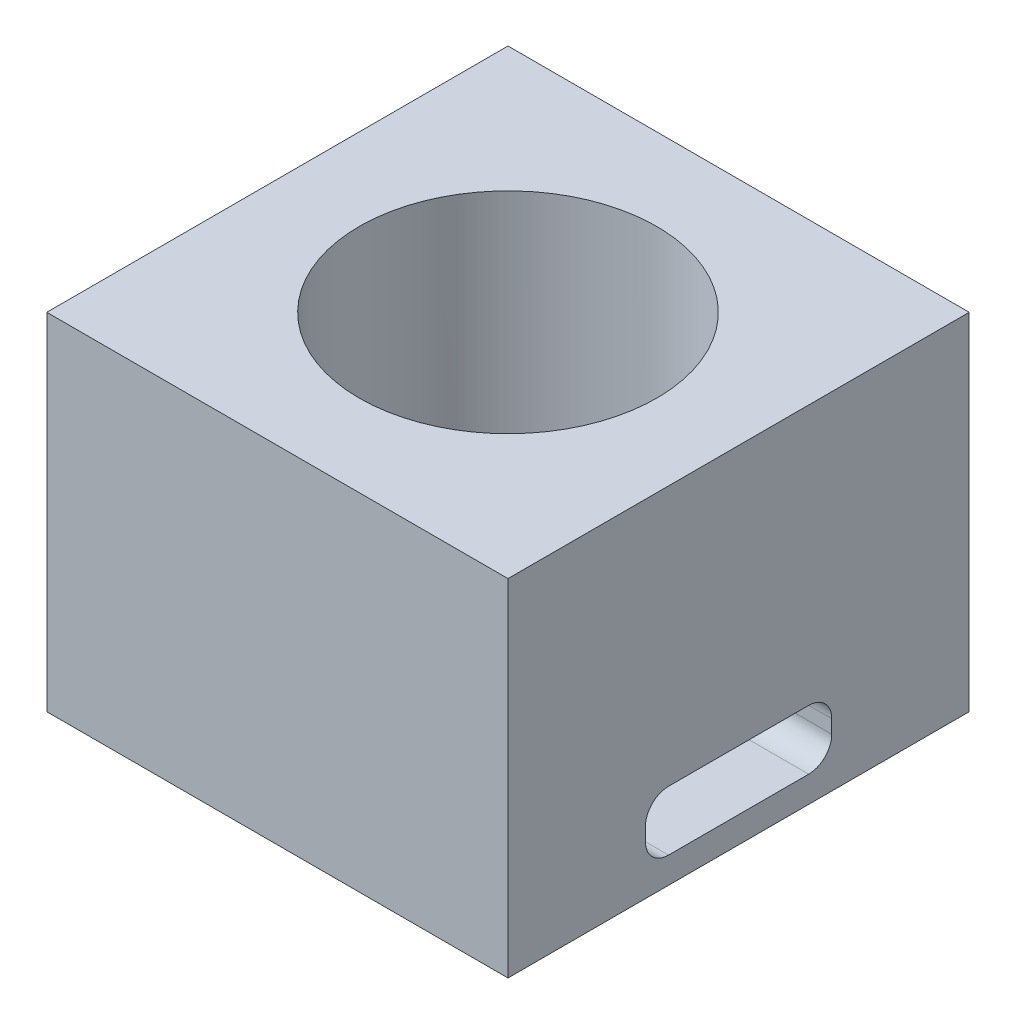
ISO-10303-21;
HEADER;
FILE_DESCRIPTION(('STEP AP214'),'2;1');
FILE_NAME('part.step','',(''),(''),'','','');
FILE_SCHEMA(('AUTOMOTIVE_DESIGN { 1 0 10303 214 1 1 1 1 }'));
ENDSEC;
DATA;
#1=APPLICATION_CONTEXT('core data for automotive mechanical design processes');
#2=APPLICATION_PROTOCOL_DEFINITION('international standard','automotive_design',2000,#1);
#3=PRODUCT_CONTEXT('',#1,'mechanical');
#4=PRODUCT('Part','Part','',(#3));
#5=PRODUCT_RELATED_PRODUCT_CATEGORY('part','',(#4));
#6=PRODUCT_DEFINITION_FORMATION('','',#4);
#7=PRODUCT_DEFINITION_CONTEXT('part definition',#1,'design');
#8=PRODUCT_DEFINITION('design','',#6,#7);
#9=PRODUCT_DEFINITION_SHAPE('','',#8);
#10=(LENGTH_UNIT() NAMED_UNIT(*) SI_UNIT(.MILLI.,.METRE.));
#11=(NAMED_UNIT(*) PLANE_ANGLE_UNIT() SI_UNIT($,.RADIAN.));
#12=(NAMED_UNIT(*) SI_UNIT($,.STERADIAN.) SOLID_ANGLE_UNIT());
#13=UNCERTAINTY_MEASURE_WITH_UNIT(LENGTH_MEASURE(1.E-05),#10,'distance_accuracy_value','');
#14=(GEOMETRIC_REPRESENTATION_CONTEXT(3) GLOBAL_UNCERTAINTY_ASSIGNED_CONTEXT((#13)) GLOBAL_UNIT_ASSIGNED_CONTEXT((#10,
#11,#12)) REPRESENTATION_CONTEXT('',''));
#15=CARTESIAN_POINT('',(0.,0.,0.));
#16=DIRECTION('',(0.,0.,1.));
#17=DIRECTION('',(1.,0.,0.));
#18=AXIS2_PLACEMENT_3D('',#15,#16,#17);
#19=CARTESIAN_POINT('',(25.4,38.1,25.4));
#20=DIRECTION('',(-1.,0.,0.));
#21=DIRECTION('',(0.,0.,1.));
#22=AXIS2_PLACEMENT_3D('',#19,#20,#21);
#23=PLANE('',#22);
#24=DIRECTION('',(0.,0.,1.));
#25=VECTOR('',#24,1.);
#26=CARTESIAN_POINT('',(25.4,9.44561507478677,7.71809552719259));
#27=LINE('',#26,#25);
#28=CARTESIAN_POINT('',(25.4,9.44561507478677,-7.71809552719259));
#29=VERTEX_POINT('',#28);
#30=CARTESIAN_POINT('',(25.4,9.44561507478677,7.71809552719259));
#31=VERTEX_POINT('',#30);
#32=EDGE_CURVE('E139',#29,#31,#27,.T.);
#33=ORIENTED_EDGE('',*,*,#32,.F.);
#34=CARTESIAN_POINT('',(25.4,6.90561507478677,-7.7180955271926));
#35=DIRECTION('',(1.,0.,0.));
#36=DIRECTION('',(0.,0.,1.));
#37=AXIS2_PLACEMENT_3D('',#34,#35,#36);
#38=CIRCLE('',#37,2.54);
#39=CARTESIAN_POINT('',(25.4,6.90561507478675,-10.2580955271926));
#40=VERTEX_POINT('',#39);
#41=EDGE_CURVE('E53',#40,#29,#38,.T.);
#42=ORIENTED_EDGE('',*,*,#41,.F.);
#43=DIRECTION('',(0.,1.,0.));
#44=VECTOR('',#43,1.);
#45=CARTESIAN_POINT('',(25.4,6.90561507478675,-10.2580955271926));
#46=LINE('',#45,#44);
#47=CARTESIAN_POINT('',(25.4,5.42459966145548,-10.2580955271926));
#48=VERTEX_POINT('',#47);
#49=EDGE_CURVE('E160',#48,#40,#46,.T.);
#50=ORIENTED_EDGE('',*,*,#49,.F.);
#51=CARTESIAN_POINT('',(25.4,5.42459966145546,-7.7180955271926));
#52=DIRECTION('',(1.,0.,0.));
#53=DIRECTION('',(0.,0.,1.));
#54=AXIS2_PLACEMENT_3D('',#51,#52,#53);
#55=CIRCLE('',#54,2.54);
#56=CARTESIAN_POINT('',(25.4,2.88459966145546,-7.71809552719259));
#57=VERTEX_POINT('',#56);
#58=EDGE_CURVE('E157',#57,#48,#55,.T.);
#59=ORIENTED_EDGE('',*,*,#58,.F.);
#60=DIRECTION('',(0.,0.,-1.));
#61=VECTOR('',#60,1.);
#62=CARTESIAN_POINT('',(25.4,2.88459966145546,7.71809552719259));
#63=LINE('',#62,#61);
#64=CARTESIAN_POINT('',(25.4,2.88459966145546,7.71809552719259));
#65=VERTEX_POINT('',#64);
#66=EDGE_CURVE('E154',#65,#57,#63,.T.);
#67=ORIENTED_EDGE('',*,*,#66,.F.);
#68=CARTESIAN_POINT('',(25.4,5.42459966145546,7.7180955271926));
#69=DIRECTION('',(1.,0.,0.));
#70=DIRECTION('',(0.,0.,1.));
#71=AXIS2_PLACEMENT_3D('',#68,#69,#70);
#72=CIRCLE('',#71,2.54);
#73=CARTESIAN_POINT('',(25.4,5.42459966145548,10.2580955271926));
#74=VERTEX_POINT('',#73);
#75=EDGE_CURVE('E148',#74,#65,#72,.T.);
#76=ORIENTED_EDGE('',*,*,#75,.F.);
#77=DIRECTION('',(0.,-1.,0.));
#78=VECTOR('',#77,1.);
#79=CARTESIAN_POINT('',(25.4,6.90561507478675,10.2580955271926));
#80=LINE('',#79,#78);
#81=CARTESIAN_POINT('',(25.4,6.90561507478675,10.2580955271926));
#82=VERTEX_POINT('',#81);
#83=EDGE_CURVE('E146',#82,#74,#80,.T.);
#84=ORIENTED_EDGE('',*,*,#83,.F.);
#85=CARTESIAN_POINT('',(25.4,6.90561507478677,7.7180955271926));
#86=DIRECTION('',(1.,0.,0.));
#87=DIRECTION('',(0.,0.,-1.));
#88=AXIS2_PLACEMENT_3D('',#85,#86,#87);
#89=CIRCLE('',#88,2.54);
#90=EDGE_CURVE('E130',#31,#82,#89,.T.);
#91=ORIENTED_EDGE('',*,*,#90,.F.);
#92=EDGE_LOOP('',(#33,#42,#50,#59,#67,#76,#84,#91));
#93=FACE_BOUND('',#92,.T.);
#94=DIRECTION('',(0.,0.,-1.));
#95=VECTOR('',#94,1.);
#96=CARTESIAN_POINT('',(25.4,0.,25.4));
#97=LINE('',#96,#95);
#98=CARTESIAN_POINT('',(25.4,0.,25.4));
#99=VERTEX_POINT('',#98);
#100=CARTESIAN_POINT('',(25.4,0.,-25.4));
#101=VERTEX_POINT('',#100);
#102=EDGE_CURVE('E190',#99,#101,#97,.T.);
#103=ORIENTED_EDGE('',*,*,#102,.T.);
#104=DIRECTION('',(0.,-1.,0.));
#105=VECTOR('',#104,1.);
#106=CARTESIAN_POINT('',(25.4,38.1,-25.4));
#107=LINE('',#106,#105);
#108=CARTESIAN_POINT('',(25.4,38.1,-25.4));
#109=VERTEX_POINT('',#108);
#110=EDGE_CURVE('E206',#109,#101,#107,.T.);
#111=ORIENTED_EDGE('',*,*,#110,.F.);
#112=DIRECTION('',(0.,0.,-1.));
#113=VECTOR('',#112,1.);
#114=CARTESIAN_POINT('',(25.4,38.1,25.4));
#115=LINE('',#114,#113);
#116=CARTESIAN_POINT('',(25.4,38.1,25.4));
#117=VERTEX_POINT('',#116);
#118=EDGE_CURVE('E179',#117,#109,#115,.T.);
#119=ORIENTED_EDGE('',*,*,#118,.F.);
#120=DIRECTION('',(0.,-1.,0.));
#121=VECTOR('',#120,1.);
#122=CARTESIAN_POINT('',(25.4,38.1,25.4));
#123=LINE('',#122,#121);
#124=EDGE_CURVE('E189',#117,#99,#123,.T.);
#125=ORIENTED_EDGE('',*,*,#124,.T.);
#126=EDGE_LOOP('',(#103,#111,#119,#125));
#127=FACE_BOUND('',#126,.T.);
#128=ADVANCED_FACE('F33',(#93,#127),#23,.F.);
#129=CARTESIAN_POINT('',(-25.4,38.1,-25.4));
#130=DIRECTION('',(0.,0.,1.));
#131=DIRECTION('',(1.,0.,0.));
#132=AXIS2_PLACEMENT_3D('',#129,#130,#131);
#133=PLANE('',#132);
#134=DIRECTION('',(-1.,0.,0.));
#135=VECTOR('',#134,1.);
#136=CARTESIAN_POINT('',(-25.4,0.,-25.4));
#137=LINE('',#136,#135);
#138=CARTESIAN_POINT('',(-25.4,0.,-25.4));
#139=VERTEX_POINT('',#138);
#140=EDGE_CURVE('E193',#101,#139,#137,.T.);
#141=ORIENTED_EDGE('',*,*,#140,.T.);
#142=DIRECTION('',(0.,-1.,0.));
#143=VECTOR('',#142,1.);
#144=CARTESIAN_POINT('',(-25.4,38.1,-25.4));
#145=LINE('',#144,#143);
#146=CARTESIAN_POINT('',(-25.4,38.1,-25.4));
#147=VERTEX_POINT('',#146);
#148=EDGE_CURVE('E203',#147,#139,#145,.T.);
#149=ORIENTED_EDGE('',*,*,#148,.F.);
#150=DIRECTION('',(-1.,0.,0.));
#151=VECTOR('',#150,1.);
#152=CARTESIAN_POINT('',(-25.4,38.1,-25.4));
#153=LINE('',#152,#151);
#154=EDGE_CURVE('E182',#109,#147,#153,.T.);
#155=ORIENTED_EDGE('',*,*,#154,.F.);
#156=ORIENTED_EDGE('',*,*,#110,.T.);
#157=EDGE_LOOP('',(#141,#149,#155,#156));
#158=FACE_BOUND('',#157,.T.);
#159=ADVANCED_FACE('F245',(#158),#133,.F.);
#160=CARTESIAN_POINT('',(-25.4,38.1,25.4));
#161=DIRECTION('',(1.,0.,0.));
#162=DIRECTION('',(0.,0.,-1.));
#163=AXIS2_PLACEMENT_3D('',#160,#161,#162);
#164=PLANE('',#163);
#165=DIRECTION('',(0.,0.,1.));
#166=VECTOR('',#165,1.);
#167=CARTESIAN_POINT('',(-25.4,0.,25.4));
#168=LINE('',#167,#166);
#169=CARTESIAN_POINT('',(-25.4,0.,25.4));
#170=VERTEX_POINT('',#169);
#171=EDGE_CURVE('E195',#139,#170,#168,.T.);
#172=ORIENTED_EDGE('',*,*,#171,.T.);
#173=DIRECTION('',(0.,-1.,0.));
#174=VECTOR('',#173,1.);
#175=CARTESIAN_POINT('',(-25.4,38.1,25.4));
#176=LINE('',#175,#174);
#177=CARTESIAN_POINT('',(-25.4,38.1,25.4));
#178=VERTEX_POINT('',#177);
#179=EDGE_CURVE('E200',#178,#170,#176,.T.);
#180=ORIENTED_EDGE('',*,*,#179,.F.);
#181=DIRECTION('',(0.,0.,1.));
#182=VECTOR('',#181,1.);
#183=CARTESIAN_POINT('',(-25.4,38.1,25.4));
#184=LINE('',#183,#182);
#185=EDGE_CURVE('E185',#147,#178,#184,.T.);
#186=ORIENTED_EDGE('',*,*,#185,.F.);
#187=ORIENTED_EDGE('',*,*,#148,.T.);
#188=EDGE_LOOP('',(#172,#180,#186,#187));
#189=FACE_BOUND('',#188,.T.);
#190=ADVANCED_FACE('F249',(#189),#164,.F.);
#191=CARTESIAN_POINT('',(-25.4,38.1,25.4));
#192=DIRECTION('',(0.,0.,-1.));
#193=DIRECTION('',(-1.,0.,0.));
#194=AXIS2_PLACEMENT_3D('',#191,#192,#193);
#195=PLANE('',#194);
#196=DIRECTION('',(1.,0.,0.));
#197=VECTOR('',#196,1.);
#198=CARTESIAN_POINT('',(-25.4,0.,25.4));
#199=LINE('',#198,#197);
#200=EDGE_CURVE('E183',#170,#99,#199,.T.);
#201=ORIENTED_EDGE('',*,*,#200,.T.);
#202=ORIENTED_EDGE('',*,*,#124,.F.);
#203=DIRECTION('',(1.,0.,0.));
#204=VECTOR('',#203,1.);
#205=CARTESIAN_POINT('',(-25.4,38.1,25.4));
#206=LINE('',#205,#204);
#207=EDGE_CURVE('E187',#178,#117,#206,.T.);
#208=ORIENTED_EDGE('',*,*,#207,.F.);
#209=ORIENTED_EDGE('',*,*,#179,.T.);
#210=EDGE_LOOP('',(#201,#202,#208,#209));
#211=FACE_BOUND('',#210,.T.);
#212=ADVANCED_FACE('F254',(#211),#195,.F.);
#213=CARTESIAN_POINT('',(0.,38.1,0.));
#214=DIRECTION('',(0.,-1.,0.));
#215=DIRECTION('',(0.,0.,-1.));
#216=AXIS2_PLACEMENT_3D('',#213,#214,#215);
#217=PLANE('',#216);
#218=CARTESIAN_POINT('',(0.,38.1,0.));
#219=DIRECTION('',(0.,1.,0.));
#220=DIRECTION('',(0.,0.,1.));
#221=AXIS2_PLACEMENT_3D('',#218,#219,#220);
#222=CIRCLE('',#221,16.383);
#223=CARTESIAN_POINT('',(0.,38.1,16.383));
#224=VERTEX_POINT('',#223);
#225=EDGE_CURVE('E165',#224,#224,#222,.T.);
#226=ORIENTED_EDGE('',*,*,#225,.F.);
#227=EDGE_LOOP('',(#226));
#228=FACE_BOUND('',#227,.T.);
#229=ORIENTED_EDGE('',*,*,#118,.T.);
#230=ORIENTED_EDGE('',*,*,#154,.T.);
#231=ORIENTED_EDGE('',*,*,#185,.T.);
#232=ORIENTED_EDGE('',*,*,#207,.T.);
#233=EDGE_LOOP('',(#229,#230,#231,#232));
#234=FACE_BOUND('',#233,.T.);
#235=ADVANCED_FACE('F260',(#228,#234),#217,.F.);
#236=CARTESIAN_POINT('',(0.,0.,0.));
#237=DIRECTION('',(0.,-1.,0.));
#238=DIRECTION('',(0.,0.,-1.));
#239=AXIS2_PLACEMENT_3D('',#236,#237,#238);
#240=PLANE('',#239);
#241=CARTESIAN_POINT('',(0.,0.,0.));
#242=DIRECTION('',(0.,-1.,0.));
#243=DIRECTION('',(0.,0.,-1.));
#244=AXIS2_PLACEMENT_3D('',#241,#242,#243);
#245=CIRCLE('',#244,16.383);
#246=CARTESIAN_POINT('',(0.,0.,-16.383));
#247=VERTEX_POINT('',#246);
#248=EDGE_CURVE('E178',#247,#247,#245,.T.);
#249=ORIENTED_EDGE('',*,*,#248,.F.);
#250=EDGE_LOOP('',(#249));
#251=FACE_BOUND('',#250,.T.);
#252=ORIENTED_EDGE('',*,*,#102,.F.);
#253=ORIENTED_EDGE('',*,*,#200,.F.);
#254=ORIENTED_EDGE('',*,*,#171,.F.);
#255=ORIENTED_EDGE('',*,*,#140,.F.);
#256=EDGE_LOOP('',(#252,#253,#254,#255));
#257=FACE_BOUND('',#256,.T.);
#258=ADVANCED_FACE('F242',(#251,#257),#240,.T.);
#259=CARTESIAN_POINT('',(0.,-11.43,0.));
#260=DIRECTION('',(0.,1.,0.));
#261=DIRECTION('',(0.,0.,1.));
#262=AXIS2_PLACEMENT_3D('',#259,#260,#261);
#263=CYLINDRICAL_SURFACE('',#262,16.383);
#264=DIRECTION('',(0.,1.,0.));
#265=VECTOR('',#264,1.);
#266=CARTESIAN_POINT('',(12.7739643476483,-11.43,-10.2580955271926));
#267=LINE('',#266,#265);
#268=CARTESIAN_POINT('',(12.7739643476483,5.42459966145548,-10.2580955271926));
#269=VERTEX_POINT('',#268);
#270=CARTESIAN_POINT('',(12.7739643476483,6.90561507478675,-10.2580955271926));
#271=VERTEX_POINT('',#270);
#272=EDGE_CURVE('E46',#269,#271,#267,.T.);
#273=ORIENTED_EDGE('',*,*,#272,.T.);
#274=CARTESIAN_POINT('',(12.7739643476483,6.90561507478675,-10.2580955271926));
#275=CARTESIAN_POINT('',(12.7739496377822,6.96685510140521,-10.2581090426164));
#276=CARTESIAN_POINT('',(12.7757424560037,7.02808452756685,-10.2558812263583));
#277=CARTESIAN_POINT('',(12.7828308152763,7.14998195680599,-10.2470475487104));
#278=CARTESIAN_POINT('',(12.788123963043,7.21065031478464,-10.2404446786751));
#279=CARTESIAN_POINT('',(12.8020512062916,7.33054236163275,-10.2230274342312));
#280=CARTESIAN_POINT('',(12.8106612627853,7.38977325812714,-10.212243359173));
#281=CARTESIAN_POINT('',(12.8310200911854,7.50679813987214,-10.1866520361665));
#282=CARTESIAN_POINT('',(12.8427692421132,7.56459195068403,-10.1718443023887));
#283=CARTESIAN_POINT('',(12.8823076416571,7.73495202917136,-10.1217909767599));
#284=CARTESIAN_POINT('',(12.9144380341897,7.84490801636366,-10.080853507264));
#285=CARTESIAN_POINT('',(12.9880790116488,8.05564441165559,-9.98579460924529));
#286=CARTESIAN_POINT('',(13.0296059978565,8.15640833873211,-9.93165011548406));
#287=CARTESIAN_POINT('',(13.1240026298884,8.35640828484961,-9.8066263386283));
#288=CARTESIAN_POINT('',(13.1775676802856,8.45463235633131,-9.73465956055892));
#289=CARTESIAN_POINT('',(13.2907028306464,8.63788200600117,-9.57962044702908));
#290=CARTESIAN_POINT('',(13.3502746824918,8.72290371525407,-9.49654486937341));
#291=CARTESIAN_POINT('',(13.4864175918223,8.89600195953157,-9.30247664039848));
#292=CARTESIAN_POINT('',(13.5639146352332,8.9809031112431,-9.18929971497895));
#293=CARTESIAN_POINT('',(13.721781184773,9.13027609318547,-8.95185679754317));
#294=CARTESIAN_POINT('',(13.8021530423771,9.19473075322535,-8.8275815972423));
#295=CARTESIAN_POINT('',(13.9309167716572,9.28076717300483,-8.62209583898042));
#296=CARTESIAN_POINT('',(13.9792061794136,9.30917589565148,-8.54360440305295));
#297=CARTESIAN_POINT('',(14.075497039308,9.35818790348789,-8.38401750045176));
#298=CARTESIAN_POINT('',(14.1234984650671,9.37879048406612,-8.30292179942368));
#299=CARTESIAN_POINT('',(14.2187788309171,9.41195382080342,-8.13867403778282));
#300=CARTESIAN_POINT('',(14.266057695581,9.42451374292351,-8.05552176482798));
#301=CARTESIAN_POINT('',(14.3595026885582,9.44134447304973,-7.88775420700512));
#302=CARTESIAN_POINT('',(14.405668667041,9.44561417101043,-7.80313872774666));
#303=CARTESIAN_POINT('',(14.4510792134404,9.44561507478677,-7.71809552719258));
#304=B_SPLINE_CURVE_WITH_KNOTS('',3,(#274,#275,#276,#277,#278,#279,#280,#281,#282,#283,#284,
#285,#286,#287,#288,#289,#290,#291,#292,#293,#294,#295,#296,#297,#298,#299,#300,#301,#302,#303),
.UNSPECIFIED.,.F.,.F.,(4,2,2,2,2,2,2,2,2,2,2,2,2,2,4),(0.,0.183636037990678,0.367146647940124,
0.549351569750082,0.731578501349012,1.09479260599276,1.45864564096741,1.85630728666487,
2.25408524756236,2.73621372141855,3.21874600327748,3.50774476581184,3.79676960824216,
4.08582441824618,4.37491792947753),.UNSPECIFIED.);
#305=CARTESIAN_POINT('',(14.4510792134404,9.44561507478677,-7.71809552719258));
#306=VERTEX_POINT('',#305);
#307=EDGE_CURVE('E11',#271,#306,#304,.T.);
#308=ORIENTED_EDGE('',*,*,#307,.T.);
#309=CARTESIAN_POINT('',(0.,9.44561507478677,0.));
#310=DIRECTION('',(0.,1.,0.));
#311=DIRECTION('',(0.,0.,1.));
#312=AXIS2_PLACEMENT_3D('',#309,#310,#311);
#313=CIRCLE('',#312,16.383);
#314=CARTESIAN_POINT('',(14.4510792134404,9.44561507478677,7.71809552719258));
#315=VERTEX_POINT('',#314);
#316=EDGE_CURVE('E209',#306,#315,#313,.F.);
#317=ORIENTED_EDGE('',*,*,#316,.T.);
#318=CARTESIAN_POINT('',(14.4510792134404,9.44561507478677,7.71809552719259));
#319=CARTESIAN_POINT('',(14.3999581115382,9.44561293262392,7.81384152663988));
#320=CARTESIAN_POINT('',(14.3478777725376,9.4402021296089,7.90903734335716));
#321=CARTESIAN_POINT('',(14.2423702932484,9.41891197437568,8.0974760676411));
#322=CARTESIAN_POINT('',(14.1889433803901,9.40303437870828,8.1907193001844));
#323=CARTESIAN_POINT('',(14.0811852750287,9.3611157560873,8.37462349631769));
#324=CARTESIAN_POINT('',(14.0268524369897,9.33505372033199,8.46527870374457));
#325=CARTESIAN_POINT('',(13.9180359958379,9.2730971083293,8.64302239467136));
#326=CARTESIAN_POINT('',(13.8635524071188,9.23720344078435,8.73011120694568));
#327=CARTESIAN_POINT('',(13.7157073393308,9.12630229059594,8.96170691581447));
#328=CARTESIAN_POINT('',(13.6227859784024,9.04180024504766,9.10208534228556));
#329=CARTESIAN_POINT('',(13.4426474150214,8.845401179038,9.36607837958275));
#330=CARTESIAN_POINT('',(13.3554209183672,8.73355028449098,9.48972067727554));
#331=CARTESIAN_POINT('',(13.2106428410726,8.51206222104762,9.68985173425248));
#332=CARTESIAN_POINT('',(13.1508682453457,8.40777554460881,9.77065629823035));
#333=CARTESIAN_POINT('',(13.0410035497459,8.18428159537955,9.91681707735222));
#334=CARTESIAN_POINT('',(12.990902270825,8.06509181125967,9.98219114456194));
#335=CARTESIAN_POINT('',(12.9112187691859,7.83444209720486,10.0849712974521));
#336=CARTESIAN_POINT('',(12.8796155928949,7.72494627966767,10.1252111951284));
#337=CARTESIAN_POINT('',(12.8279511938825,7.49901460145008,10.1905896946633));
#338=CARTESIAN_POINT('',(12.8078667219202,7.38259324748415,10.2157587199844));
#339=CARTESIAN_POINT('',(12.7876154863347,7.20519283161659,10.2410783598184));
#340=CARTESIAN_POINT('',(12.7825109469345,7.14558305005484,10.2474459587477));
#341=CARTESIAN_POINT('',(12.7756814412758,7.0258655740215,10.255957608565));
#342=CARTESIAN_POINT('',(12.7739568060749,6.96575783135419,10.258101245721));
#343=CARTESIAN_POINT('',(12.7739643476483,6.90561507478675,10.2580955271926));
#344=B_SPLINE_CURVE_WITH_KNOTS('',3,(#318,#319,#320,#321,#322,#323,#324,#325,#326,#327,#328,
#329,#330,#331,#332,#333,#334,#335,#336,#337,#338,#339,#340,#341,#342,#343),.UNSPECIFIED.,.F.,
.F.,(4,2,2,2,2,2,2,2,2,2,2,2,4),(0.,0.325426940318359,0.650799280961351,0.976846383979249,
1.30286336179663,1.86515040896685,2.42649557961718,2.85938593407437,3.29177298087561,
3.65289014348749,4.01327584205863,4.19355686301921,4.37385554141288),.UNSPECIFIED.);
#345=CARTESIAN_POINT('',(12.7739643476483,6.90561507478675,10.2580955271926));
#346=VERTEX_POINT('',#345);
#347=EDGE_CURVE('E133',#315,#346,#344,.T.);
#348=ORIENTED_EDGE('',*,*,#347,.T.);
#349=DIRECTION('',(0.,1.,0.));
#350=VECTOR('',#349,1.);
#351=CARTESIAN_POINT('',(12.7739643476483,-11.43,10.2580955271926));
#352=LINE('',#351,#350);
#353=CARTESIAN_POINT('',(12.7739643476483,5.42459966145548,10.2580955271926));
#354=VERTEX_POINT('',#353);
#355=EDGE_CURVE('E219',#346,#354,#352,.F.);
#356=ORIENTED_EDGE('',*,*,#355,.T.);
#357=CARTESIAN_POINT('',(12.7739643476483,5.42459966145548,10.2580955271926));
#358=CARTESIAN_POINT('',(12.7739496377822,5.36335963483701,10.2581090426164));
#359=CARTESIAN_POINT('',(12.7757424560037,5.30213020867537,10.2558812263583));
#360=CARTESIAN_POINT('',(12.7828308152763,5.18023277943623,10.2470475487104));
#361=CARTESIAN_POINT('',(12.788123963043,5.11956442145758,10.2404446786751));
#362=CARTESIAN_POINT('',(12.8020512062916,4.99967237460947,10.2230274342312));
#363=CARTESIAN_POINT('',(12.8106612627853,4.94044147811508,10.212243359173));
#364=CARTESIAN_POINT('',(12.8310200911854,4.82341659637009,10.1866520361665));
#365=CARTESIAN_POINT('',(12.8427692421132,4.76562278555819,10.1718443023887));
#366=CARTESIAN_POINT('',(12.8823076416571,4.59526270707086,10.1217909767599));
#367=CARTESIAN_POINT('',(12.9144380341897,4.48530671987857,10.080853507264));
#368=CARTESIAN_POINT('',(12.9880790116488,4.27457032458663,9.98579460924528));
#369=CARTESIAN_POINT('',(13.0296059978565,4.17380639751011,9.93165011548406));
#370=CARTESIAN_POINT('',(13.1240026298884,3.97380645139261,9.8066263386283));
#371=CARTESIAN_POINT('',(13.1775676802856,3.87558237991091,9.73465956055892));
#372=CARTESIAN_POINT('',(13.2907028306464,3.69233273024105,9.57962044702908));
#373=CARTESIAN_POINT('',(13.3502746824918,3.60731102098816,9.49654486937341));
#374=CARTESIAN_POINT('',(13.4864175918223,3.43421277671066,9.30247664039848));
#375=CARTESIAN_POINT('',(13.5639146352332,3.34931162499913,9.18929971497895));
#376=CARTESIAN_POINT('',(13.721781184773,3.19993864305676,8.95185679754317));
#377=CARTESIAN_POINT('',(13.8021530423771,3.13548398301688,8.8275815972423));
#378=CARTESIAN_POINT('',(13.9309167716572,3.0494475632374,8.62209583898042));
#379=CARTESIAN_POINT('',(13.9792061794136,3.02103884059074,8.54360440305295));
#380=CARTESIAN_POINT('',(14.075497039308,2.97202683275434,8.38401750045176));
#381=CARTESIAN_POINT('',(14.1234984650671,2.9514242521761,8.30292179942368));
#382=CARTESIAN_POINT('',(14.2187788309171,2.91826091543881,8.13867403778282));
#383=CARTESIAN_POINT('',(14.266057695581,2.90570099331872,8.05552176482798));
#384=CARTESIAN_POINT('',(14.3595026885582,2.8888702631925,7.88775420700512));
#385=CARTESIAN_POINT('',(14.405668667041,2.8846005652318,7.80313872774666));
#386=CARTESIAN_POINT('',(14.4510792134404,2.88459966145546,7.71809552719259));
#387=B_SPLINE_CURVE_WITH_KNOTS('',3,(#357,#358,#359,#360,#361,#362,#363,#364,#365,#366,#367,
#368,#369,#370,#371,#372,#373,#374,#375,#376,#377,#378,#379,#380,#381,#382,#383,#384,#385,#386),
.UNSPECIFIED.,.F.,.F.,(4,2,2,2,2,2,2,2,2,2,2,2,2,2,4),(0.,0.183636037990678,0.367146647940125,
0.549351569750083,0.731578501349012,1.09479260599276,1.45864564096741,1.85630728666487,
2.25408524756236,2.73621372141854,3.21874600327748,3.50774476581184,3.79676960824216,
4.08582441824618,4.37491792947753),.UNSPECIFIED.);
#388=CARTESIAN_POINT('',(14.4510792134404,2.88459966145546,7.71809552719259));
#389=VERTEX_POINT('',#388);
#390=EDGE_CURVE('E376',#354,#389,#387,.T.);
#391=ORIENTED_EDGE('',*,*,#390,.T.);
#392=CARTESIAN_POINT('',(0.,2.88459966145546,0.));
#393=DIRECTION('',(0.,-1.,0.));
#394=DIRECTION('',(0.,0.,-1.));
#395=AXIS2_PLACEMENT_3D('',#392,#393,#394);
#396=CIRCLE('',#395,16.383);
#397=CARTESIAN_POINT('',(14.4510792134404,2.88459966145546,-7.71809552719258));
#398=VERTEX_POINT('',#397);
#399=EDGE_CURVE('E367',#389,#398,#396,.F.);
#400=ORIENTED_EDGE('',*,*,#399,.T.);
#401=CARTESIAN_POINT('',(14.4510792134404,2.88459966145546,-7.71809552719259));
#402=CARTESIAN_POINT('',(14.3999581115382,2.8846018036183,-7.81384152663988));
#403=CARTESIAN_POINT('',(14.3478777725376,2.89001260663332,-7.90903734335716));
#404=CARTESIAN_POINT('',(14.2423702932484,2.91130276186655,-8.0974760676411));
#405=CARTESIAN_POINT('',(14.1889433803901,2.92718035753394,-8.1907193001844));
#406=CARTESIAN_POINT('',(14.0811852750287,2.96909898015493,-8.37462349631769));
#407=CARTESIAN_POINT('',(14.0268524369897,2.99516101591023,-8.46527870374457));
#408=CARTESIAN_POINT('',(13.9180359958379,3.05711762791292,-8.64302239467136));
#409=CARTESIAN_POINT('',(13.8635524071188,3.09301129545787,-8.73011120694568));
#410=CARTESIAN_POINT('',(13.7157073393308,3.20391244564629,-8.96170691581447));
#411=CARTESIAN_POINT('',(13.6227859784024,3.28841449119457,-9.10208534228557));
#412=CARTESIAN_POINT('',(13.4426474150214,3.48481355720423,-9.36607837958275));
#413=CARTESIAN_POINT('',(13.3554209183672,3.59666445175125,-9.48972067727554));
#414=CARTESIAN_POINT('',(13.2106428410726,3.81815251519461,-9.68985173425248));
#415=CARTESIAN_POINT('',(13.1508682453457,3.92243919163341,-9.77065629823035));
#416=CARTESIAN_POINT('',(13.0410035497459,4.14593314086268,-9.91681707735222));
#417=CARTESIAN_POINT('',(12.990902270825,4.26512292498255,-9.98219114456194));
#418=CARTESIAN_POINT('',(12.9112187691859,4.49577263903736,-10.0849712974521));
#419=CARTESIAN_POINT('',(12.8796155928949,4.60526845657456,-10.1252111951284));
#420=CARTESIAN_POINT('',(12.8279511938825,4.83120013479215,-10.1905896946633));
#421=CARTESIAN_POINT('',(12.8078667219202,4.94762148875808,-10.2157587199844));
#422=CARTESIAN_POINT('',(12.7876154863347,5.12502190462564,-10.2410783598184));
#423=CARTESIAN_POINT('',(12.7825109469345,5.18463168618739,-10.2474459587477));
#424=CARTESIAN_POINT('',(12.7756814412758,5.30434916222073,-10.255957608565));
#425=CARTESIAN_POINT('',(12.7739568060749,5.36445690488803,-10.258101245721));
#426=CARTESIAN_POINT('',(12.7739643476483,5.42459966145548,-10.2580955271926));
#427=B_SPLINE_CURVE_WITH_KNOTS('',3,(#401,#402,#403,#404,#405,#406,#407,#408,#409,#410,#411,
#412,#413,#414,#415,#416,#417,#418,#419,#420,#421,#422,#423,#424,#425,#426),.UNSPECIFIED.,.F.,
.F.,(4,2,2,2,2,2,2,2,2,2,2,2,4),(0.,0.325426940318359,0.650799280961351,0.976846383979249,
1.30286336179663,1.86515040896685,2.42649557961718,2.85938593407436,3.29177298087562,
3.65289014348749,4.01327584205863,4.19355686301921,4.37385554141288),.UNSPECIFIED.);
#428=EDGE_CURVE('E366',#398,#269,#427,.T.);
#429=ORIENTED_EDGE('',*,*,#428,.T.);
#430=EDGE_LOOP('',(#273,#308,#317,#348,#356,#391,#400,#429));
#431=FACE_BOUND('',#430,.T.);
#432=ORIENTED_EDGE('',*,*,#248,.T.);
#433=EDGE_LOOP('',(#432));
#434=FACE_BOUND('',#433,.T.);
#435=ORIENTED_EDGE('',*,*,#225,.T.);
#436=EDGE_LOOP('',(#435));
#437=FACE_BOUND('',#436,.T.);
#438=ADVANCED_FACE('F221',(#431,#434,#437),#263,.F.);
#439=CARTESIAN_POINT('',(-3.80999999999999,6.90561507478677,-7.7180955271926));
#440=DIRECTION('',(1.,0.,0.));
#441=DIRECTION('',(0.,0.,-1.));
#442=AXIS2_PLACEMENT_3D('',#439,#440,#441);
#443=CYLINDRICAL_SURFACE('',#442,2.54);
#444=DIRECTION('',(1.,0.,0.));
#445=VECTOR('',#444,1.);
#446=CARTESIAN_POINT('',(-3.80999999999999,6.90561507478675,-10.2580955271926));
#447=LINE('',#446,#445);
#448=EDGE_CURVE('E163',#271,#40,#447,.T.);
#449=ORIENTED_EDGE('',*,*,#448,.T.);
#450=ORIENTED_EDGE('',*,*,#41,.T.);
#451=DIRECTION('',(1.,0.,0.));
#452=VECTOR('',#451,1.);
#453=CARTESIAN_POINT('',(-3.80999999999999,9.44561507478677,-7.71809552719259));
#454=LINE('',#453,#452);
#455=EDGE_CURVE('E136',#306,#29,#454,.T.);
#456=ORIENTED_EDGE('',*,*,#455,.F.);
#457=ORIENTED_EDGE('',*,*,#307,.F.);
#458=EDGE_LOOP('',(#449,#450,#456,#457));
#459=FACE_BOUND('',#458,.T.);
#460=ADVANCED_FACE('F231',(#459),#443,.F.);
#461=CARTESIAN_POINT('',(-3.80999999999999,6.90561507478675,-10.2580955271926));
#462=DIRECTION('',(0.,0.,-1.));
#463=DIRECTION('',(-1.,0.,0.));
#464=AXIS2_PLACEMENT_3D('',#461,#462,#463);
#465=PLANE('',#464);
#466=DIRECTION('',(1.,0.,0.));
#467=VECTOR('',#466,1.);
#468=CARTESIAN_POINT('',(-3.80999999999999,5.42459966145548,-10.2580955271926));
#469=LINE('',#468,#467);
#470=EDGE_CURVE('E166',#269,#48,#469,.T.);
#471=ORIENTED_EDGE('',*,*,#470,.T.);
#472=ORIENTED_EDGE('',*,*,#49,.T.);
#473=ORIENTED_EDGE('',*,*,#448,.F.);
#474=ORIENTED_EDGE('',*,*,#272,.F.);
#475=EDGE_LOOP('',(#471,#472,#473,#474));
#476=FACE_BOUND('',#475,.T.);
#477=ADVANCED_FACE('F234',(#476),#465,.F.);
#478=CARTESIAN_POINT('',(-3.80999999999999,5.42459966145546,-7.7180955271926));
#479=DIRECTION('',(1.,0.,0.));
#480=DIRECTION('',(0.,0.,-1.));
#481=AXIS2_PLACEMENT_3D('',#478,#479,#480);
#482=CYLINDRICAL_SURFACE('',#481,2.54);
#483=DIRECTION('',(1.,0.,0.));
#484=VECTOR('',#483,1.);
#485=CARTESIAN_POINT('',(-3.80999999999999,2.88459966145546,-7.71809552719259));
#486=LINE('',#485,#484);
#487=EDGE_CURVE('E168',#398,#57,#486,.T.);
#488=ORIENTED_EDGE('',*,*,#487,.T.);
#489=ORIENTED_EDGE('',*,*,#58,.T.);
#490=ORIENTED_EDGE('',*,*,#470,.F.);
#491=ORIENTED_EDGE('',*,*,#428,.F.);
#492=EDGE_LOOP('',(#488,#489,#490,#491));
#493=FACE_BOUND('',#492,.T.);
#494=ADVANCED_FACE('F239',(#493),#482,.F.);
#495=CARTESIAN_POINT('',(-3.80999999999999,2.88459966145546,7.71809552719259));
#496=DIRECTION('',(0.,-1.,0.));
#497=DIRECTION('',(0.,0.,-1.));
#498=AXIS2_PLACEMENT_3D('',#495,#496,#497);
#499=PLANE('',#498);
#500=DIRECTION('',(1.,0.,0.));
#501=VECTOR('',#500,1.);
#502=CARTESIAN_POINT('',(-3.80999999999999,2.88459966145546,7.71809552719259));
#503=LINE('',#502,#501);
#504=EDGE_CURVE('E170',#389,#65,#503,.T.);
#505=ORIENTED_EDGE('',*,*,#504,.T.);
#506=ORIENTED_EDGE('',*,*,#66,.T.);
#507=ORIENTED_EDGE('',*,*,#487,.F.);
#508=ORIENTED_EDGE('',*,*,#399,.F.);
#509=EDGE_LOOP('',(#505,#506,#507,#508));
#510=FACE_BOUND('',#509,.T.);
#511=ADVANCED_FACE('F313',(#510),#499,.F.);
#512=CARTESIAN_POINT('',(-3.80999999999999,5.42459966145546,7.7180955271926));
#513=DIRECTION('',(1.,0.,0.));
#514=DIRECTION('',(0.,0.,-1.));
#515=AXIS2_PLACEMENT_3D('',#512,#513,#514);
#516=CYLINDRICAL_SURFACE('',#515,2.54);
#517=DIRECTION('',(1.,0.,0.));
#518=VECTOR('',#517,1.);
#519=CARTESIAN_POINT('',(-3.80999999999999,5.42459966145548,10.2580955271926));
#520=LINE('',#519,#518);
#521=EDGE_CURVE('E172',#354,#74,#520,.T.);
#522=ORIENTED_EDGE('',*,*,#521,.T.);
#523=ORIENTED_EDGE('',*,*,#75,.T.);
#524=ORIENTED_EDGE('',*,*,#504,.F.);
#525=ORIENTED_EDGE('',*,*,#390,.F.);
#526=EDGE_LOOP('',(#522,#523,#524,#525));
#527=FACE_BOUND('',#526,.T.);
#528=ADVANCED_FACE('F323',(#527),#516,.F.);
#529=CARTESIAN_POINT('',(-3.80999999999999,6.90561507478675,10.2580955271926));
#530=DIRECTION('',(0.,0.,1.));
#531=DIRECTION('',(1.,0.,0.));
#532=AXIS2_PLACEMENT_3D('',#529,#530,#531);
#533=PLANE('',#532);
#534=DIRECTION('',(1.,0.,0.));
#535=VECTOR('',#534,1.);
#536=CARTESIAN_POINT('',(-3.80999999999999,6.90561507478675,10.2580955271926));
#537=LINE('',#536,#535);
#538=EDGE_CURVE('E135',#346,#82,#537,.T.);
#539=ORIENTED_EDGE('',*,*,#538,.T.);
#540=ORIENTED_EDGE('',*,*,#83,.T.);
#541=ORIENTED_EDGE('',*,*,#521,.F.);
#542=ORIENTED_EDGE('',*,*,#355,.F.);
#543=EDGE_LOOP('',(#539,#540,#541,#542));
#544=FACE_BOUND('',#543,.T.);
#545=ADVANCED_FACE('F228',(#544),#533,.F.);
#546=CARTESIAN_POINT('',(-3.80999999999999,6.90561507478677,7.7180955271926));
#547=DIRECTION('',(1.,0.,0.));
#548=DIRECTION('',(0.,0.,-1.));
#549=AXIS2_PLACEMENT_3D('',#546,#547,#548);
#550=CYLINDRICAL_SURFACE('',#549,2.54);
#551=DIRECTION('',(1.,0.,0.));
#552=VECTOR('',#551,1.);
#553=CARTESIAN_POINT('',(-3.80999999999999,9.44561507478677,7.71809552719259));
#554=LINE('',#553,#552);
#555=EDGE_CURVE('E61',#315,#31,#554,.T.);
#556=ORIENTED_EDGE('',*,*,#555,.T.);
#557=ORIENTED_EDGE('',*,*,#90,.T.);
#558=ORIENTED_EDGE('',*,*,#538,.F.);
#559=ORIENTED_EDGE('',*,*,#347,.F.);
#560=EDGE_LOOP('',(#556,#557,#558,#559));
#561=FACE_BOUND('',#560,.T.);
#562=ADVANCED_FACE('F127',(#561),#550,.F.);
#563=CARTESIAN_POINT('',(-3.80999999999999,9.44561507478677,7.71809552719259));
#564=DIRECTION('',(0.,1.,0.));
#565=DIRECTION('',(0.,0.,1.));
#566=AXIS2_PLACEMENT_3D('',#563,#564,#565);
#567=PLANE('',#566);
#568=ORIENTED_EDGE('',*,*,#455,.T.);
#569=ORIENTED_EDGE('',*,*,#32,.T.);
#570=ORIENTED_EDGE('',*,*,#555,.F.);
#571=ORIENTED_EDGE('',*,*,#316,.F.);
#572=EDGE_LOOP('',(#568,#569,#570,#571));
#573=FACE_BOUND('',#572,.T.);
#574=ADVANCED_FACE('F140',(#573),#567,.F.);
#575=CLOSED_SHELL('',(#128,#159,#190,#212,#235,#258,#438,#460,#477,#494,#511,#528,#545,#562,#574));
#576=MANIFOLD_SOLID_BREP('B2',#575);
#577=ADVANCED_BREP_SHAPE_REPRESENTATION('',(#18,#576),#14);
#578=SHAPE_DEFINITION_REPRESENTATION(#9,#577);
ENDSEC;
END-ISO-10303-21;
